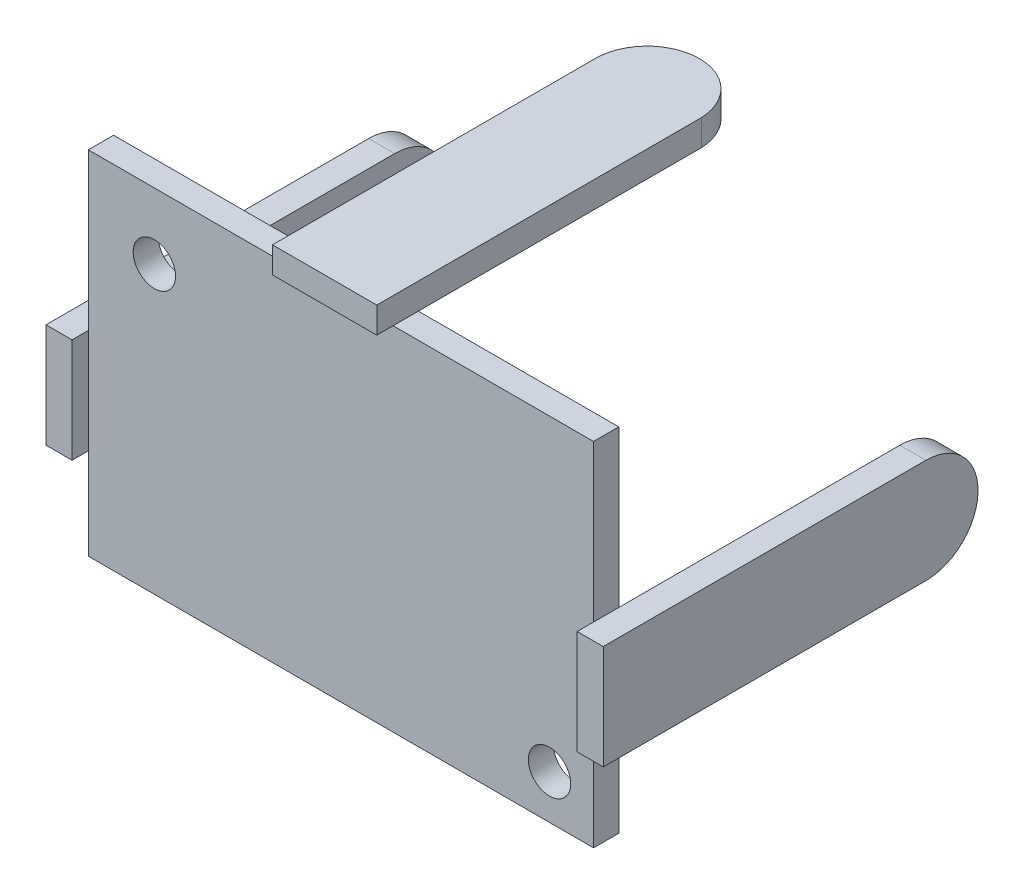
ISO-10303-21;
HEADER;
FILE_DESCRIPTION(('STEP AP214'),'2;1');
FILE_NAME('part.step','',(''),(''),'','','');
FILE_SCHEMA(('AUTOMOTIVE_DESIGN { 1 0 10303 214 1 1 1 1 }'));
ENDSEC;
DATA;
#1=APPLICATION_CONTEXT('core data for automotive mechanical design processes');
#2=APPLICATION_PROTOCOL_DEFINITION('international standard','automotive_design',2000,#1);
#3=PRODUCT_CONTEXT('',#1,'mechanical');
#4=PRODUCT('Part','Part','',(#3));
#5=PRODUCT_RELATED_PRODUCT_CATEGORY('part','',(#4));
#6=PRODUCT_DEFINITION_FORMATION('','',#4);
#7=PRODUCT_DEFINITION_CONTEXT('part definition',#1,'design');
#8=PRODUCT_DEFINITION('design','',#6,#7);
#9=PRODUCT_DEFINITION_SHAPE('','',#8);
#10=(LENGTH_UNIT() NAMED_UNIT(*) SI_UNIT(.MILLI.,.METRE.));
#11=(NAMED_UNIT(*) PLANE_ANGLE_UNIT() SI_UNIT($,.RADIAN.));
#12=(NAMED_UNIT(*) SI_UNIT($,.STERADIAN.) SOLID_ANGLE_UNIT());
#13=UNCERTAINTY_MEASURE_WITH_UNIT(LENGTH_MEASURE(1.E-05),#10,'distance_accuracy_value','');
#14=(GEOMETRIC_REPRESENTATION_CONTEXT(3) GLOBAL_UNCERTAINTY_ASSIGNED_CONTEXT((#13)) GLOBAL_UNIT_ASSIGNED_CONTEXT((#10,
#11,#12)) REPRESENTATION_CONTEXT('',''));
#15=CARTESIAN_POINT('',(0.,0.,0.));
#16=DIRECTION('',(0.,0.,1.));
#17=DIRECTION('',(1.,0.,0.));
#18=AXIS2_PLACEMENT_3D('',#15,#16,#17);
#19=CARTESIAN_POINT('',(17.1,-5.2,1.55));
#20=DIRECTION('',(0.,1.,0.));
#21=DIRECTION('',(0.,0.,1.));
#22=AXIS2_PLACEMENT_3D('',#19,#20,#21);
#23=PLANE('',#22);
#24=DIRECTION('',(0.,0.,-1.));
#25=VECTOR('',#24,1.);
#26=CARTESIAN_POINT('',(15.5,-5.2,1.55));
#27=LINE('',#26,#25);
#28=CARTESIAN_POINT('',(15.5,-5.2,2.55));
#29=VERTEX_POINT('',#28);
#30=CARTESIAN_POINT('',(15.5,-5.2,-17.364147134296));
#31=VERTEX_POINT('',#30);
#32=EDGE_CURVE('E116',#29,#31,#27,.T.);
#33=ORIENTED_EDGE('',*,*,#32,.T.);
#34=DIRECTION('',(-1.,0.,0.));
#35=VECTOR('',#34,1.);
#36=CARTESIAN_POINT('',(17.1,-5.2,-17.364147134296));
#37=LINE('',#36,#35);
#38=CARTESIAN_POINT('',(17.1,-5.2,-17.364147134296));
#39=VERTEX_POINT('',#38);
#40=EDGE_CURVE('E12',#39,#31,#37,.T.);
#41=ORIENTED_EDGE('',*,*,#40,.F.);
#42=DIRECTION('',(0.,0.,-1.));
#43=VECTOR('',#42,1.);
#44=CARTESIAN_POINT('',(17.1,-5.2,1.55));
#45=LINE('',#44,#43);
#46=CARTESIAN_POINT('',(17.1,-5.2,2.55));
#47=VERTEX_POINT('',#46);
#48=EDGE_CURVE('E95',#47,#39,#45,.T.);
#49=ORIENTED_EDGE('',*,*,#48,.F.);
#50=DIRECTION('',(-1.,0.,0.));
#51=VECTOR('',#50,1.);
#52=CARTESIAN_POINT('',(17.1,-5.2,2.55));
#53=LINE('',#52,#51);
#54=EDGE_CURVE('E115',#47,#29,#53,.T.);
#55=ORIENTED_EDGE('',*,*,#54,.T.);
#56=EDGE_LOOP('',(#33,#41,#49,#55));
#57=FACE_BOUND('',#56,.T.);
#58=ADVANCED_FACE('F53',(#57),#23,.F.);
#59=CARTESIAN_POINT('',(17.1,-2.00103650553792,-17.2489634944621));
#60=DIRECTION('',(-1.,0.,0.));
#61=DIRECTION('',(0.,0.,1.));
#62=AXIS2_PLACEMENT_3D('',#59,#60,#61);
#63=CYLINDRICAL_SURFACE('',#62,3.20103650553792);
#64=CARTESIAN_POINT('',(15.5,-2.00103650553792,-17.2489634944621));
#65=DIRECTION('',(-1.,0.,0.));
#66=DIRECTION('',(0.,-1.,0.));
#67=AXIS2_PLACEMENT_3D('',#64,#65,#66);
#68=CIRCLE('',#67,3.20103650553792);
#69=CARTESIAN_POINT('',(15.5,1.2,-17.2489634944621));
#70=VERTEX_POINT('',#69);
#71=EDGE_CURVE('E105',#70,#31,#68,.T.);
#72=ORIENTED_EDGE('',*,*,#71,.F.);
#73=DIRECTION('',(-1.,0.,0.));
#74=VECTOR('',#73,1.);
#75=CARTESIAN_POINT('',(17.1,1.2,-17.2489634944621));
#76=LINE('',#75,#74);
#77=CARTESIAN_POINT('',(17.1,1.2,-17.2489634944621));
#78=VERTEX_POINT('',#77);
#79=EDGE_CURVE('E61',#78,#70,#76,.T.);
#80=ORIENTED_EDGE('',*,*,#79,.F.);
#81=CARTESIAN_POINT('',(17.1,-2.00103650553792,-17.2489634944621));
#82=DIRECTION('',(-1.,0.,0.));
#83=DIRECTION('',(0.,-1.,0.));
#84=AXIS2_PLACEMENT_3D('',#81,#82,#83);
#85=CIRCLE('',#84,3.20103650553792);
#86=EDGE_CURVE('E103',#78,#39,#85,.T.);
#87=ORIENTED_EDGE('',*,*,#86,.T.);
#88=ORIENTED_EDGE('',*,*,#40,.T.);
#89=EDGE_LOOP('',(#72,#80,#87,#88));
#90=FACE_BOUND('',#89,.T.);
#91=ADVANCED_FACE('F102',(#90),#63,.T.);
#92=CARTESIAN_POINT('',(17.1,1.2,1.55));
#93=DIRECTION('',(0.,-1.,0.));
#94=DIRECTION('',(0.,0.,-1.));
#95=AXIS2_PLACEMENT_3D('',#92,#93,#94);
#96=PLANE('',#95);
#97=DIRECTION('',(0.,0.,1.));
#98=VECTOR('',#97,1.);
#99=CARTESIAN_POINT('',(15.5,1.2,1.55));
#100=LINE('',#99,#98);
#101=CARTESIAN_POINT('',(15.5,1.2,2.55));
#102=VERTEX_POINT('',#101);
#103=EDGE_CURVE('E84',#70,#102,#100,.T.);
#104=ORIENTED_EDGE('',*,*,#103,.T.);
#105=DIRECTION('',(-1.,0.,0.));
#106=VECTOR('',#105,1.);
#107=CARTESIAN_POINT('',(17.1,1.2,2.55));
#108=LINE('',#107,#106);
#109=CARTESIAN_POINT('',(17.1,1.2,2.55));
#110=VERTEX_POINT('',#109);
#111=EDGE_CURVE('E106',#110,#102,#108,.T.);
#112=ORIENTED_EDGE('',*,*,#111,.F.);
#113=DIRECTION('',(0.,0.,1.));
#114=VECTOR('',#113,1.);
#115=CARTESIAN_POINT('',(17.1,1.2,1.55));
#116=LINE('',#115,#114);
#117=EDGE_CURVE('E107',#78,#110,#116,.T.);
#118=ORIENTED_EDGE('',*,*,#117,.F.);
#119=ORIENTED_EDGE('',*,*,#79,.T.);
#120=EDGE_LOOP('',(#104,#112,#118,#119));
#121=FACE_BOUND('',#120,.T.);
#122=ADVANCED_FACE('F108',(#121),#96,.F.);
#123=CARTESIAN_POINT('',(17.1,10.8,2.55));
#124=DIRECTION('',(0.,0.,-1.));
#125=DIRECTION('',(0.,1.,0.));
#126=AXIS2_PLACEMENT_3D('',#123,#124,#125);
#127=PLANE('',#126);
#128=DIRECTION('',(0.,-1.,0.));
#129=VECTOR('',#128,1.);
#130=CARTESIAN_POINT('',(15.5,10.8,2.55));
#131=LINE('',#130,#129);
#132=EDGE_CURVE('E90',#102,#29,#131,.T.);
#133=ORIENTED_EDGE('',*,*,#132,.T.);
#134=ORIENTED_EDGE('',*,*,#54,.F.);
#135=DIRECTION('',(0.,-1.,0.));
#136=VECTOR('',#135,1.);
#137=CARTESIAN_POINT('',(17.1,10.8,2.55));
#138=LINE('',#137,#136);
#139=EDGE_CURVE('E69',#110,#47,#138,.T.);
#140=ORIENTED_EDGE('',*,*,#139,.F.);
#141=ORIENTED_EDGE('',*,*,#111,.T.);
#142=EDGE_LOOP('',(#133,#134,#140,#141));
#143=FACE_BOUND('',#142,.T.);
#144=ADVANCED_FACE('F123',(#143),#127,.F.);
#145=CARTESIAN_POINT('',(17.1,-2.00103650553792,-17.2489634944621));
#146=DIRECTION('',(-1.,0.,0.));
#147=DIRECTION('',(0.,-1.,0.));
#148=AXIS2_PLACEMENT_3D('',#145,#146,#147);
#149=PLANE('',#148);
#150=ORIENTED_EDGE('',*,*,#48,.T.);
#151=ORIENTED_EDGE('',*,*,#86,.F.);
#152=ORIENTED_EDGE('',*,*,#117,.T.);
#153=ORIENTED_EDGE('',*,*,#139,.T.);
#154=EDGE_LOOP('',(#150,#151,#152,#153));
#155=FACE_BOUND('',#154,.T.);
#156=ADVANCED_FACE('F110',(#155),#149,.F.);
#157=CARTESIAN_POINT('',(15.5,-2.00103650553792,-17.2489634944621));
#158=DIRECTION('',(-1.,0.,0.));
#159=DIRECTION('',(0.,-1.,0.));
#160=AXIS2_PLACEMENT_3D('',#157,#158,#159);
#161=PLANE('',#160);
#162=ORIENTED_EDGE('',*,*,#32,.F.);
#163=ORIENTED_EDGE('',*,*,#132,.F.);
#164=ORIENTED_EDGE('',*,*,#103,.F.);
#165=ORIENTED_EDGE('',*,*,#71,.T.);
#166=EDGE_LOOP('',(#162,#163,#164,#165));
#167=FACE_BOUND('',#166,.T.);
#168=ADVANCED_FACE('F126',(#167),#161,.T.);
#169=CLOSED_SHELL('',(#58,#91,#122,#144,#156,#168));
#170=MANIFOLD_SOLID_BREP('B2',#169);
#171=CARTESIAN_POINT('',(15.5,10.8,1.55));
#172=DIRECTION('',(0.,-1.,0.));
#173=DIRECTION('',(1.,0.,0.));
#174=AXIS2_PLACEMENT_3D('',#171,#172,#173);
#175=PLANE('',#174);
#176=DIRECTION('',(0.,0.,1.));
#177=VECTOR('',#176,1.);
#178=CARTESIAN_POINT('',(-3.2,10.8,2.55));
#179=LINE('',#178,#177);
#180=CARTESIAN_POINT('',(-3.2,10.8,0.));
#181=VERTEX_POINT('',#180);
#182=CARTESIAN_POINT('',(-3.2,10.8,1.55));
#183=VERTEX_POINT('',#182);
#184=EDGE_CURVE('E51',#181,#183,#179,.T.);
#185=ORIENTED_EDGE('',*,*,#184,.F.);
#186=DIRECTION('',(-1.,0.,0.));
#187=VECTOR('',#186,1.);
#188=CARTESIAN_POINT('',(15.5,10.8,0.));
#189=LINE('',#188,#187);
#190=CARTESIAN_POINT('',(-15.5,10.8,0.));
#191=VERTEX_POINT('',#190);
#192=EDGE_CURVE('E437',#181,#191,#189,.T.);
#193=ORIENTED_EDGE('',*,*,#192,.T.);
#194=DIRECTION('',(0.,0.,-1.));
#195=VECTOR('',#194,1.);
#196=CARTESIAN_POINT('',(-15.5,10.8,1.55));
#197=LINE('',#196,#195);
#198=CARTESIAN_POINT('',(-15.5,10.8,1.55));
#199=VERTEX_POINT('',#198);
#200=EDGE_CURVE('E424',#199,#191,#197,.T.);
#201=ORIENTED_EDGE('',*,*,#200,.F.);
#202=DIRECTION('',(-1.,0.,0.));
#203=VECTOR('',#202,1.);
#204=CARTESIAN_POINT('',(15.5,10.8,1.55));
#205=LINE('',#204,#203);
#206=EDGE_CURVE('E209',#183,#199,#205,.T.);
#207=ORIENTED_EDGE('',*,*,#206,.F.);
#208=EDGE_LOOP('',(#185,#193,#201,#207));
#209=FACE_BOUND('',#208,.T.);
#210=ADVANCED_FACE('F189',(#209),#175,.F.);
#211=DIRECTION('',(0.,0.,-1.));
#212=VECTOR('',#211,1.);
#213=CARTESIAN_POINT('',(3.2,10.8,2.55));
#214=LINE('',#213,#212);
#215=CARTESIAN_POINT('',(3.2,10.8,1.55));
#216=VERTEX_POINT('',#215);
#217=CARTESIAN_POINT('',(3.2,10.8,0.));
#218=VERTEX_POINT('',#217);
#219=EDGE_CURVE('E199',#216,#218,#214,.T.);
#220=ORIENTED_EDGE('',*,*,#219,.F.);
#221=CARTESIAN_POINT('',(15.5,10.8,1.55));
#222=VERTEX_POINT('',#221);
#223=EDGE_CURVE('E421',#222,#216,#205,.T.);
#224=ORIENTED_EDGE('',*,*,#223,.F.);
#225=DIRECTION('',(0.,0.,-1.));
#226=VECTOR('',#225,1.);
#227=CARTESIAN_POINT('',(15.5,10.8,1.55));
#228=LINE('',#227,#226);
#229=CARTESIAN_POINT('',(15.5,10.8,0.));
#230=VERTEX_POINT('',#229);
#231=EDGE_CURVE('E445',#222,#230,#228,.T.);
#232=ORIENTED_EDGE('',*,*,#231,.T.);
#233=EDGE_CURVE('E438',#230,#218,#189,.T.);
#234=ORIENTED_EDGE('',*,*,#233,.T.);
#235=EDGE_LOOP('',(#220,#224,#232,#234));
#236=FACE_BOUND('',#235,.T.);
#237=ADVANCED_FACE('F550',(#236),#175,.F.);
#238=CARTESIAN_POINT('',(-15.5,10.8,1.55));
#239=DIRECTION('',(1.,0.,0.));
#240=DIRECTION('',(0.,1.,0.));
#241=AXIS2_PLACEMENT_3D('',#238,#239,#240);
#242=PLANE('',#241);
#243=DIRECTION('',(0.,-1.,0.));
#244=VECTOR('',#243,1.);
#245=CARTESIAN_POINT('',(-15.5,10.8,1.55));
#246=LINE('',#245,#244);
#247=CARTESIAN_POINT('',(-15.5,-5.2,1.55));
#248=VERTEX_POINT('',#247);
#249=CARTESIAN_POINT('',(-15.5,-10.8,1.55));
#250=VERTEX_POINT('',#249);
#251=EDGE_CURVE('E415',#248,#250,#246,.T.);
#252=ORIENTED_EDGE('',*,*,#251,.F.);
#253=DIRECTION('',(0.,0.,-1.));
#254=VECTOR('',#253,1.);
#255=CARTESIAN_POINT('',(-15.5,-5.2,1.55));
#256=LINE('',#255,#254);
#257=CARTESIAN_POINT('',(-15.5,-5.2,0.));
#258=VERTEX_POINT('',#257);
#259=EDGE_CURVE('E341',#248,#258,#256,.T.);
#260=ORIENTED_EDGE('',*,*,#259,.T.);
#261=DIRECTION('',(0.,-1.,0.));
#262=VECTOR('',#261,1.);
#263=CARTESIAN_POINT('',(-15.5,10.8,0.));
#264=LINE('',#263,#262);
#265=CARTESIAN_POINT('',(-15.5,-10.8,0.));
#266=VERTEX_POINT('',#265);
#267=EDGE_CURVE('E405',#258,#266,#264,.T.);
#268=ORIENTED_EDGE('',*,*,#267,.T.);
#269=DIRECTION('',(0.,0.,-1.));
#270=VECTOR('',#269,1.);
#271=CARTESIAN_POINT('',(-15.5,-10.8,1.55));
#272=LINE('',#271,#270);
#273=EDGE_CURVE('E193',#250,#266,#272,.T.);
#274=ORIENTED_EDGE('',*,*,#273,.F.);
#275=EDGE_LOOP('',(#252,#260,#268,#274));
#276=FACE_BOUND('',#275,.T.);
#277=ADVANCED_FACE('F486',(#276),#242,.F.);
#278=CARTESIAN_POINT('',(0.,0.,1.55));
#279=DIRECTION('',(0.,0.,-1.));
#280=DIRECTION('',(-1.,0.,0.));
#281=AXIS2_PLACEMENT_3D('',#278,#279,#280);
#282=PLANE('',#281);
#283=CARTESIAN_POINT('',(-15.5,1.2,1.55));
#284=VERTEX_POINT('',#283);
#285=EDGE_CURVE('E409',#199,#284,#246,.T.);
#286=ORIENTED_EDGE('',*,*,#285,.T.);
#287=EDGE_CURVE('E414',#284,#248,#246,.T.);
#288=ORIENTED_EDGE('',*,*,#287,.T.);
#289=ORIENTED_EDGE('',*,*,#251,.T.);
#290=DIRECTION('',(1.,0.,0.));
#291=VECTOR('',#290,1.);
#292=CARTESIAN_POINT('',(15.5,-10.8,1.55));
#293=LINE('',#292,#291);
#294=CARTESIAN_POINT('',(15.5,-10.8,1.55));
#295=VERTEX_POINT('',#294);
#296=EDGE_CURVE('E413',#250,#295,#293,.T.);
#297=ORIENTED_EDGE('',*,*,#296,.T.);
#298=DIRECTION('',(0.,1.,0.));
#299=VECTOR('',#298,1.);
#300=CARTESIAN_POINT('',(15.5,10.8,1.55));
#301=LINE('',#300,#299);
#302=EDGE_CURVE('E418',#295,#222,#301,.T.);
#303=ORIENTED_EDGE('',*,*,#302,.T.);
#304=ORIENTED_EDGE('',*,*,#223,.T.);
#305=EDGE_CURVE('E425',#216,#183,#205,.T.);
#306=ORIENTED_EDGE('',*,*,#305,.T.);
#307=ORIENTED_EDGE('',*,*,#206,.T.);
#308=EDGE_LOOP('',(#286,#288,#289,#297,#303,#304,#306,#307));
#309=FACE_BOUND('',#308,.T.);
#310=CARTESIAN_POINT('',(12.8,-8.1,1.55));
#311=DIRECTION('',(0.,0.,1.));
#312=DIRECTION('',(1.,0.,0.));
#313=AXIS2_PLACEMENT_3D('',#310,#311,#312);
#314=CIRCLE('',#313,1.3);
#315=CARTESIAN_POINT('',(11.5,-8.1,1.55));
#316=VERTEX_POINT('',#315);
#317=EDGE_CURVE('E401',#316,#316,#314,.T.);
#318=ORIENTED_EDGE('',*,*,#317,.F.);
#319=EDGE_LOOP('',(#318));
#320=FACE_BOUND('',#319,.T.);
#321=CARTESIAN_POINT('',(-11.45,6.75,1.55));
#322=DIRECTION('',(0.,0.,1.));
#323=DIRECTION('',(1.,0.,0.));
#324=AXIS2_PLACEMENT_3D('',#321,#322,#323);
#325=CIRCLE('',#324,1.3);
#326=CARTESIAN_POINT('',(-12.75,6.75,1.55));
#327=VERTEX_POINT('',#326);
#328=EDGE_CURVE('E393',#327,#327,#325,.T.);
#329=ORIENTED_EDGE('',*,*,#328,.F.);
#330=EDGE_LOOP('',(#329));
#331=FACE_BOUND('',#330,.T.);
#332=ADVANCED_FACE('F490',(#309,#320,#331),#282,.F.);
#333=CARTESIAN_POINT('',(0.,0.,0.));
#334=DIRECTION('',(0.,0.,-1.));
#335=DIRECTION('',(-1.,0.,0.));
#336=AXIS2_PLACEMENT_3D('',#333,#334,#335);
#337=PLANE('',#336);
#338=CARTESIAN_POINT('',(12.8,-8.1,0.));
#339=DIRECTION('',(0.,0.,1.));
#340=DIRECTION('',(1.,0.,0.));
#341=AXIS2_PLACEMENT_3D('',#338,#339,#340);
#342=CIRCLE('',#341,1.3);
#343=CARTESIAN_POINT('',(11.5,-8.1,0.));
#344=VERTEX_POINT('',#343);
#345=EDGE_CURVE('E397',#344,#344,#342,.T.);
#346=ORIENTED_EDGE('',*,*,#345,.T.);
#347=EDGE_LOOP('',(#346));
#348=FACE_BOUND('',#347,.T.);
#349=CARTESIAN_POINT('',(-15.5,1.2,0.));
#350=VERTEX_POINT('',#349);
#351=EDGE_CURVE('E426',#191,#350,#264,.T.);
#352=ORIENTED_EDGE('',*,*,#351,.F.);
#353=ORIENTED_EDGE('',*,*,#192,.F.);
#354=EDGE_CURVE('E441',#218,#181,#189,.T.);
#355=ORIENTED_EDGE('',*,*,#354,.F.);
#356=ORIENTED_EDGE('',*,*,#233,.F.);
#357=DIRECTION('',(0.,1.,0.));
#358=VECTOR('',#357,1.);
#359=CARTESIAN_POINT('',(15.5,10.8,0.));
#360=LINE('',#359,#358);
#361=CARTESIAN_POINT('',(15.5,-10.8,0.));
#362=VERTEX_POINT('',#361);
#363=EDGE_CURVE('E434',#362,#230,#360,.T.);
#364=ORIENTED_EDGE('',*,*,#363,.F.);
#365=DIRECTION('',(1.,0.,0.));
#366=VECTOR('',#365,1.);
#367=CARTESIAN_POINT('',(15.5,-10.8,0.));
#368=LINE('',#367,#366);
#369=EDGE_CURVE('E430',#266,#362,#368,.T.);
#370=ORIENTED_EDGE('',*,*,#369,.F.);
#371=ORIENTED_EDGE('',*,*,#267,.F.);
#372=EDGE_CURVE('E431',#350,#258,#264,.T.);
#373=ORIENTED_EDGE('',*,*,#372,.F.);
#374=EDGE_LOOP('',(#352,#353,#355,#356,#364,#370,#371,#373));
#375=FACE_BOUND('',#374,.T.);
#376=CARTESIAN_POINT('',(-11.45,6.75,0.));
#377=DIRECTION('',(0.,0.,1.));
#378=DIRECTION('',(1.,0.,0.));
#379=AXIS2_PLACEMENT_3D('',#376,#377,#378);
#380=CIRCLE('',#379,1.3);
#381=CARTESIAN_POINT('',(-12.75,6.75,0.));
#382=VERTEX_POINT('',#381);
#383=EDGE_CURVE('E382',#382,#382,#380,.T.);
#384=ORIENTED_EDGE('',*,*,#383,.T.);
#385=EDGE_LOOP('',(#384));
#386=FACE_BOUND('',#385,.T.);
#387=ADVANCED_FACE('F502',(#348,#375,#386),#337,.T.);
#388=ORIENTED_EDGE('',*,*,#351,.T.);
#389=DIRECTION('',(0.,0.,1.));
#390=VECTOR('',#389,1.);
#391=CARTESIAN_POINT('',(-15.5,1.2,1.55));
#392=LINE('',#391,#390);
#393=EDGE_CURVE('E375',#350,#284,#392,.T.);
#394=ORIENTED_EDGE('',*,*,#393,.T.);
#395=ORIENTED_EDGE('',*,*,#285,.F.);
#396=ORIENTED_EDGE('',*,*,#200,.T.);
#397=EDGE_LOOP('',(#388,#394,#395,#396));
#398=FACE_BOUND('',#397,.T.);
#399=ADVANCED_FACE('F191',(#398),#242,.F.);
#400=CARTESIAN_POINT('',(15.5,-10.8,1.55));
#401=DIRECTION('',(0.,1.,0.));
#402=DIRECTION('',(-1.,0.,0.));
#403=AXIS2_PLACEMENT_3D('',#400,#401,#402);
#404=PLANE('',#403);
#405=ORIENTED_EDGE('',*,*,#369,.T.);
#406=DIRECTION('',(0.,0.,-1.));
#407=VECTOR('',#406,1.);
#408=CARTESIAN_POINT('',(15.5,-10.8,1.55));
#409=LINE('',#408,#407);
#410=EDGE_CURVE('E448',#295,#362,#409,.T.);
#411=ORIENTED_EDGE('',*,*,#410,.F.);
#412=ORIENTED_EDGE('',*,*,#296,.F.);
#413=ORIENTED_EDGE('',*,*,#273,.T.);
#414=EDGE_LOOP('',(#405,#411,#412,#413));
#415=FACE_BOUND('',#414,.T.);
#416=ADVANCED_FACE('F505',(#415),#404,.F.);
#417=CARTESIAN_POINT('',(15.5,10.8,1.55));
#418=DIRECTION('',(-1.,0.,0.));
#419=DIRECTION('',(0.,-1.,0.));
#420=AXIS2_PLACEMENT_3D('',#417,#418,#419);
#421=PLANE('',#420);
#422=ORIENTED_EDGE('',*,*,#363,.T.);
#423=ORIENTED_EDGE('',*,*,#231,.F.);
#424=ORIENTED_EDGE('',*,*,#302,.F.);
#425=ORIENTED_EDGE('',*,*,#410,.T.);
#426=EDGE_LOOP('',(#422,#423,#424,#425));
#427=FACE_BOUND('',#426,.T.);
#428=ADVANCED_FACE('F507',(#427),#421,.F.);
#429=CARTESIAN_POINT('',(12.8,-8.1,1.55));
#430=DIRECTION('',(0.,0.,-1.));
#431=DIRECTION('',(-1.,0.,0.));
#432=AXIS2_PLACEMENT_3D('',#429,#430,#431);
#433=CYLINDRICAL_SURFACE('',#432,1.3);
#434=CARTESIAN_POINT('',(11.5,-8.1,1.55));
#435=CARTESIAN_POINT('',(11.5,-8.1,1.53385416666667));
#436=CARTESIAN_POINT('',(11.5,-8.1,1.51770833333333));
#437=CARTESIAN_POINT('',(11.5,-8.1,1.48541666666667));
#438=CARTESIAN_POINT('',(11.5,-8.1,1.46927083333333));
#439=CARTESIAN_POINT('',(11.5,-8.1,1.43697916666667));
#440=CARTESIAN_POINT('',(11.5,-8.1,1.42083333333333));
#441=CARTESIAN_POINT('',(11.5,-8.1,1.38854166666667));
#442=CARTESIAN_POINT('',(11.5,-8.1,1.37239583333333));
#443=CARTESIAN_POINT('',(11.5,-8.1,1.34010416666667));
#444=CARTESIAN_POINT('',(11.5,-8.1,1.32395833333333));
#445=CARTESIAN_POINT('',(11.5,-8.1,1.29166666666667));
#446=CARTESIAN_POINT('',(11.5,-8.1,1.27552083333333));
#447=CARTESIAN_POINT('',(11.5,-8.1,1.24322916666667));
#448=CARTESIAN_POINT('',(11.5,-8.1,1.22708333333333));
#449=CARTESIAN_POINT('',(11.5,-8.1,1.19479166666667));
#450=CARTESIAN_POINT('',(11.5,-8.1,1.17864583333333));
#451=CARTESIAN_POINT('',(11.5,-8.1,1.14635416666667));
#452=CARTESIAN_POINT('',(11.5,-8.1,1.13020833333333));
#453=CARTESIAN_POINT('',(11.5,-8.1,1.09791666666667));
#454=CARTESIAN_POINT('',(11.5,-8.1,1.08177083333333));
#455=CARTESIAN_POINT('',(11.5,-8.1,1.04947916666667));
#456=CARTESIAN_POINT('',(11.5,-8.1,1.03333333333333));
#457=CARTESIAN_POINT('',(11.5,-8.1,1.00104166666667));
#458=CARTESIAN_POINT('',(11.5,-8.1,0.984895833333333));
#459=CARTESIAN_POINT('',(11.5,-8.1,0.952604166666667));
#460=CARTESIAN_POINT('',(11.5,-8.1,0.936458333333333));
#461=CARTESIAN_POINT('',(11.5,-8.1,0.904166666666667));
#462=CARTESIAN_POINT('',(11.5,-8.1,0.888020833333333));
#463=CARTESIAN_POINT('',(11.5,-8.1,0.855729166666667));
#464=CARTESIAN_POINT('',(11.5,-8.1,0.839583333333333));
#465=CARTESIAN_POINT('',(11.5,-8.1,0.807291666666667));
#466=CARTESIAN_POINT('',(11.5,-8.1,0.791145833333333));
#467=CARTESIAN_POINT('',(11.5,-8.1,0.758854166666667));
#468=CARTESIAN_POINT('',(11.5,-8.1,0.742708333333333));
#469=CARTESIAN_POINT('',(11.5,-8.1,0.710416666666667));
#470=CARTESIAN_POINT('',(11.5,-8.1,0.694270833333333));
#471=CARTESIAN_POINT('',(11.5,-8.1,0.661979166666667));
#472=CARTESIAN_POINT('',(11.5,-8.1,0.645833333333333));
#473=CARTESIAN_POINT('',(11.5,-8.1,0.613541666666667));
#474=CARTESIAN_POINT('',(11.5,-8.1,0.597395833333333));
#475=CARTESIAN_POINT('',(11.5,-8.1,0.565104166666667));
#476=CARTESIAN_POINT('',(11.5,-8.1,0.548958333333333));
#477=CARTESIAN_POINT('',(11.5,-8.1,0.516666666666667));
#478=CARTESIAN_POINT('',(11.5,-8.1,0.500520833333333));
#479=CARTESIAN_POINT('',(11.5,-8.1,0.468229166666667));
#480=CARTESIAN_POINT('',(11.5,-8.1,0.452083333333333));
#481=CARTESIAN_POINT('',(11.5,-8.1,0.419791666666667));
#482=CARTESIAN_POINT('',(11.5,-8.1,0.403645833333333));
#483=CARTESIAN_POINT('',(11.5,-8.1,0.371354166666667));
#484=CARTESIAN_POINT('',(11.5,-8.1,0.355208333333333));
#485=CARTESIAN_POINT('',(11.5,-8.1,0.322916666666667));
#486=CARTESIAN_POINT('',(11.5,-8.1,0.306770833333333));
#487=CARTESIAN_POINT('',(11.5,-8.1,0.274479166666667));
#488=CARTESIAN_POINT('',(11.5,-8.1,0.258333333333333));
#489=CARTESIAN_POINT('',(11.5,-8.1,0.226041666666667));
#490=CARTESIAN_POINT('',(11.5,-8.1,0.209895833333333));
#491=CARTESIAN_POINT('',(11.5,-8.1,0.177604166666667));
#492=CARTESIAN_POINT('',(11.5,-8.1,0.161458333333333));
#493=CARTESIAN_POINT('',(11.5,-8.1,0.129166666666667));
#494=CARTESIAN_POINT('',(11.5,-8.1,0.113020833333333));
#495=CARTESIAN_POINT('',(11.5,-8.1,0.0807291666666667));
#496=CARTESIAN_POINT('',(11.5,-8.1,0.0645833333333334));
#497=CARTESIAN_POINT('',(11.5,-8.1,0.0322916666666667));
#498=CARTESIAN_POINT('',(11.5,-8.1,0.0161458333333334));
#499=CARTESIAN_POINT('',(11.5,-8.1,0.));
#500=B_SPLINE_CURVE_WITH_KNOTS('',3,(#434,#435,#436,#437,#438,#439,#440,#441,#442,#443,#444,
#445,#446,#447,#448,#449,#450,#451,#452,#453,#454,#455,#456,#457,#458,#459,#460,#461,#462,#463,
#464,#465,#466,#467,#468,#469,#470,#471,#472,#473,#474,#475,#476,#477,#478,#479,#480,#481,#482,
#483,#484,#485,#486,#487,#488,#489,#490,#491,#492,#493,#494,#495,#496,#497,#498,#499),
.UNSPECIFIED.,.F.,.F.,(4,2,2,2,2,2,2,2,2,2,2,2,2,2,2,2,2,2,2,2,2,2,2,2,2,2,2,2,2,2,2,2,4),(0.,
0.0484374999999999,0.096875,0.1453125,0.19375,0.2421875,0.290625,0.3390625,0.3875,0.4359375,
0.484375,0.5328125,0.58125,0.6296875,0.678125,0.7265625,0.775,0.8234375,0.871875,0.9203125,
0.96875,1.0171875,1.065625,1.1140625,1.1625,1.2109375,1.259375,1.3078125,1.35625,1.4046875,
1.453125,1.5015625,1.55),.UNSPECIFIED.);
#501=EDGE_CURVE('BSEAM559',#316,#344,#500,.T.);
#502=ORIENTED_EDGE('',*,*,#317,.T.);
#503=ORIENTED_EDGE('',*,*,#345,.F.);
#504=ORIENTED_EDGE('',*,*,#501,.T.);
#505=ORIENTED_EDGE('',*,*,#501,.F.);
#506=EDGE_LOOP('',(#502,#504,#503,#505));
#507=FACE_BOUND('',#506,.T.);
#508=ADVANCED_FACE('F559',(#507),#433,.F.);
#509=CARTESIAN_POINT('',(-11.45,6.75,1.55));
#510=DIRECTION('',(0.,0.,-1.));
#511=DIRECTION('',(-1.,0.,0.));
#512=AXIS2_PLACEMENT_3D('',#509,#510,#511);
#513=CYLINDRICAL_SURFACE('',#512,1.3);
#514=CARTESIAN_POINT('',(-12.75,6.75,1.55));
#515=CARTESIAN_POINT('',(-12.75,6.75,1.53385416666667));
#516=CARTESIAN_POINT('',(-12.75,6.75,1.51770833333333));
#517=CARTESIAN_POINT('',(-12.75,6.75,1.48541666666667));
#518=CARTESIAN_POINT('',(-12.75,6.75,1.46927083333333));
#519=CARTESIAN_POINT('',(-12.75,6.75,1.43697916666667));
#520=CARTESIAN_POINT('',(-12.75,6.75,1.42083333333333));
#521=CARTESIAN_POINT('',(-12.75,6.75,1.38854166666667));
#522=CARTESIAN_POINT('',(-12.75,6.75,1.37239583333333));
#523=CARTESIAN_POINT('',(-12.75,6.75,1.34010416666667));
#524=CARTESIAN_POINT('',(-12.75,6.75,1.32395833333333));
#525=CARTESIAN_POINT('',(-12.75,6.75,1.29166666666667));
#526=CARTESIAN_POINT('',(-12.75,6.75,1.27552083333333));
#527=CARTESIAN_POINT('',(-12.75,6.75,1.24322916666667));
#528=CARTESIAN_POINT('',(-12.75,6.75,1.22708333333333));
#529=CARTESIAN_POINT('',(-12.75,6.75,1.19479166666667));
#530=CARTESIAN_POINT('',(-12.75,6.75,1.17864583333333));
#531=CARTESIAN_POINT('',(-12.75,6.75,1.14635416666667));
#532=CARTESIAN_POINT('',(-12.75,6.75,1.13020833333333));
#533=CARTESIAN_POINT('',(-12.75,6.75,1.09791666666667));
#534=CARTESIAN_POINT('',(-12.75,6.75,1.08177083333333));
#535=CARTESIAN_POINT('',(-12.75,6.75,1.04947916666667));
#536=CARTESIAN_POINT('',(-12.75,6.75,1.03333333333333));
#537=CARTESIAN_POINT('',(-12.75,6.75,1.00104166666667));
#538=CARTESIAN_POINT('',(-12.75,6.75,0.984895833333333));
#539=CARTESIAN_POINT('',(-12.75,6.75,0.952604166666667));
#540=CARTESIAN_POINT('',(-12.75,6.75,0.936458333333333));
#541=CARTESIAN_POINT('',(-12.75,6.75,0.904166666666667));
#542=CARTESIAN_POINT('',(-12.75,6.75,0.888020833333333));
#543=CARTESIAN_POINT('',(-12.75,6.75,0.855729166666667));
#544=CARTESIAN_POINT('',(-12.75,6.75,0.839583333333333));
#545=CARTESIAN_POINT('',(-12.75,6.75,0.807291666666667));
#546=CARTESIAN_POINT('',(-12.75,6.75,0.791145833333333));
#547=CARTESIAN_POINT('',(-12.75,6.75,0.758854166666667));
#548=CARTESIAN_POINT('',(-12.75,6.75,0.742708333333333));
#549=CARTESIAN_POINT('',(-12.75,6.75,0.710416666666667));
#550=CARTESIAN_POINT('',(-12.75,6.75,0.694270833333333));
#551=CARTESIAN_POINT('',(-12.75,6.75,0.661979166666667));
#552=CARTESIAN_POINT('',(-12.75,6.75,0.645833333333333));
#553=CARTESIAN_POINT('',(-12.75,6.75,0.613541666666667));
#554=CARTESIAN_POINT('',(-12.75,6.75,0.597395833333333));
#555=CARTESIAN_POINT('',(-12.75,6.75,0.565104166666667));
#556=CARTESIAN_POINT('',(-12.75,6.75,0.548958333333333));
#557=CARTESIAN_POINT('',(-12.75,6.75,0.516666666666667));
#558=CARTESIAN_POINT('',(-12.75,6.75,0.500520833333333));
#559=CARTESIAN_POINT('',(-12.75,6.75,0.468229166666667));
#560=CARTESIAN_POINT('',(-12.75,6.75,0.452083333333333));
#561=CARTESIAN_POINT('',(-12.75,6.75,0.419791666666667));
#562=CARTESIAN_POINT('',(-12.75,6.75,0.403645833333333));
#563=CARTESIAN_POINT('',(-12.75,6.75,0.371354166666667));
#564=CARTESIAN_POINT('',(-12.75,6.75,0.355208333333333));
#565=CARTESIAN_POINT('',(-12.75,6.75,0.322916666666667));
#566=CARTESIAN_POINT('',(-12.75,6.75,0.306770833333333));
#567=CARTESIAN_POINT('',(-12.75,6.75,0.274479166666667));
#568=CARTESIAN_POINT('',(-12.75,6.75,0.258333333333333));
#569=CARTESIAN_POINT('',(-12.75,6.75,0.226041666666667));
#570=CARTESIAN_POINT('',(-12.75,6.75,0.209895833333333));
#571=CARTESIAN_POINT('',(-12.75,6.75,0.177604166666667));
#572=CARTESIAN_POINT('',(-12.75,6.75,0.161458333333333));
#573=CARTESIAN_POINT('',(-12.75,6.75,0.129166666666667));
#574=CARTESIAN_POINT('',(-12.75,6.75,0.113020833333333));
#575=CARTESIAN_POINT('',(-12.75,6.75,0.0807291666666667));
#576=CARTESIAN_POINT('',(-12.75,6.75,0.0645833333333334));
#577=CARTESIAN_POINT('',(-12.75,6.75,0.0322916666666667));
#578=CARTESIAN_POINT('',(-12.75,6.75,0.0161458333333334));
#579=CARTESIAN_POINT('',(-12.75,6.75,0.));
#580=B_SPLINE_CURVE_WITH_KNOTS('',3,(#514,#515,#516,#517,#518,#519,#520,#521,#522,#523,#524,
#525,#526,#527,#528,#529,#530,#531,#532,#533,#534,#535,#536,#537,#538,#539,#540,#541,#542,#543,
#544,#545,#546,#547,#548,#549,#550,#551,#552,#553,#554,#555,#556,#557,#558,#559,#560,#561,#562,
#563,#564,#565,#566,#567,#568,#569,#570,#571,#572,#573,#574,#575,#576,#577,#578,#579),
.UNSPECIFIED.,.F.,.F.,(4,2,2,2,2,2,2,2,2,2,2,2,2,2,2,2,2,2,2,2,2,2,2,2,2,2,2,2,2,2,2,2,4),(0.,
0.0484374999999999,0.096875,0.1453125,0.19375,0.2421875,0.290625,0.3390625,0.3875,0.4359375,
0.484375,0.5328125,0.58125,0.6296875,0.678125,0.7265625,0.775,0.8234375,0.871875,0.9203125,
0.96875,1.0171875,1.065625,1.1140625,1.1625,1.2109375,1.259375,1.3078125,1.35625,1.4046875,
1.453125,1.5015625,1.55),.UNSPECIFIED.);
#581=EDGE_CURVE('BSEAM563',#327,#382,#580,.T.);
#582=ORIENTED_EDGE('',*,*,#328,.T.);
#583=ORIENTED_EDGE('',*,*,#383,.F.);
#584=ORIENTED_EDGE('',*,*,#581,.T.);
#585=ORIENTED_EDGE('',*,*,#581,.F.);
#586=EDGE_LOOP('',(#582,#584,#583,#585));
#587=FACE_BOUND('',#586,.T.);
#588=ADVANCED_FACE('F563',(#587),#513,.F.);
#589=CARTESIAN_POINT('',(-15.5,-2.00103650553792,-17.2489634944621));
#590=DIRECTION('',(1.,0.,0.));
#591=DIRECTION('',(0.,1.,0.));
#592=AXIS2_PLACEMENT_3D('',#589,#590,#591);
#593=PLANE('',#592);
#594=ORIENTED_EDGE('',*,*,#287,.F.);
#595=CARTESIAN_POINT('',(-15.5,1.2,2.55));
#596=VERTEX_POINT('',#595);
#597=EDGE_CURVE('E370',#284,#596,#392,.T.);
#598=ORIENTED_EDGE('',*,*,#597,.T.);
#599=DIRECTION('',(0.,-1.,0.));
#600=VECTOR('',#599,1.);
#601=CARTESIAN_POINT('',(-15.5,10.8,2.55));
#602=LINE('',#601,#600);
#603=CARTESIAN_POINT('',(-15.5,-5.2,2.55));
#604=VERTEX_POINT('',#603);
#605=EDGE_CURVE('E351',#596,#604,#602,.T.);
#606=ORIENTED_EDGE('',*,*,#605,.T.);
#607=EDGE_CURVE('E339',#604,#248,#256,.T.);
#608=ORIENTED_EDGE('',*,*,#607,.T.);
#609=EDGE_LOOP('',(#594,#598,#606,#608));
#610=FACE_BOUND('',#609,.T.);
#611=ADVANCED_FACE('F469',(#610),#593,.T.);
#612=CARTESIAN_POINT('',(-17.1,-5.2,1.55));
#613=DIRECTION('',(0.,-1.,0.));
#614=DIRECTION('',(0.,0.,-1.));
#615=AXIS2_PLACEMENT_3D('',#612,#613,#614);
#616=PLANE('',#615);
#617=ORIENTED_EDGE('',*,*,#607,.F.);
#618=DIRECTION('',(1.,0.,0.));
#619=VECTOR('',#618,1.);
#620=CARTESIAN_POINT('',(-17.1,-5.2,2.55));
#621=LINE('',#620,#619);
#622=CARTESIAN_POINT('',(-17.1,-5.2,2.55));
#623=VERTEX_POINT('',#622);
#624=EDGE_CURVE('E379',#623,#604,#621,.T.);
#625=ORIENTED_EDGE('',*,*,#624,.F.);
#626=DIRECTION('',(0.,0.,-1.));
#627=VECTOR('',#626,1.);
#628=CARTESIAN_POINT('',(-17.1,-5.2,1.55));
#629=LINE('',#628,#627);
#630=CARTESIAN_POINT('',(-17.1,-5.2,-17.364147134296));
#631=VERTEX_POINT('',#630);
#632=EDGE_CURVE('E346',#623,#631,#629,.T.);
#633=ORIENTED_EDGE('',*,*,#632,.T.);
#634=DIRECTION('',(1.,0.,0.));
#635=VECTOR('',#634,1.);
#636=CARTESIAN_POINT('',(-17.1,-5.2,-17.364147134296));
#637=LINE('',#636,#635);
#638=CARTESIAN_POINT('',(-15.5,-5.2,-17.364147134296));
#639=VERTEX_POINT('',#638);
#640=EDGE_CURVE('E362',#631,#639,#637,.T.);
#641=ORIENTED_EDGE('',*,*,#640,.T.);
#642=EDGE_CURVE('E335',#258,#639,#256,.T.);
#643=ORIENTED_EDGE('',*,*,#642,.F.);
#644=ORIENTED_EDGE('',*,*,#259,.F.);
#645=EDGE_LOOP('',(#617,#625,#633,#641,#643,#644));
#646=FACE_BOUND('',#645,.T.);
#647=ADVANCED_FACE('F482',(#646),#616,.T.);
#648=CARTESIAN_POINT('',(-17.1,10.8,2.55));
#649=DIRECTION('',(0.,0.,1.));
#650=DIRECTION('',(0.,-1.,0.));
#651=AXIS2_PLACEMENT_3D('',#648,#649,#650);
#652=PLANE('',#651);
#653=ORIENTED_EDGE('',*,*,#605,.F.);
#654=DIRECTION('',(1.,0.,0.));
#655=VECTOR('',#654,1.);
#656=CARTESIAN_POINT('',(-17.1,1.2,2.55));
#657=LINE('',#656,#655);
#658=CARTESIAN_POINT('',(-17.1,1.2,2.55));
#659=VERTEX_POINT('',#658);
#660=EDGE_CURVE('E383',#659,#596,#657,.T.);
#661=ORIENTED_EDGE('',*,*,#660,.F.);
#662=DIRECTION('',(0.,-1.,0.));
#663=VECTOR('',#662,1.);
#664=CARTESIAN_POINT('',(-17.1,10.8,2.55));
#665=LINE('',#664,#663);
#666=EDGE_CURVE('E359',#659,#623,#665,.T.);
#667=ORIENTED_EDGE('',*,*,#666,.T.);
#668=ORIENTED_EDGE('',*,*,#624,.T.);
#669=EDGE_LOOP('',(#653,#661,#667,#668));
#670=FACE_BOUND('',#669,.T.);
#671=ADVANCED_FACE('F478',(#670),#652,.T.);
#672=CARTESIAN_POINT('',(-17.1,1.2,1.55));
#673=DIRECTION('',(0.,1.,0.));
#674=DIRECTION('',(0.,0.,1.));
#675=AXIS2_PLACEMENT_3D('',#672,#673,#674);
#676=PLANE('',#675);
#677=CARTESIAN_POINT('',(-15.5,1.2,-17.2489634944621));
#678=VERTEX_POINT('',#677);
#679=EDGE_CURVE('E371',#678,#350,#392,.T.);
#680=ORIENTED_EDGE('',*,*,#679,.F.);
#681=DIRECTION('',(1.,0.,0.));
#682=VECTOR('',#681,1.);
#683=CARTESIAN_POINT('',(-17.1,1.2,-17.2489634944621));
#684=LINE('',#683,#682);
#685=CARTESIAN_POINT('',(-17.1,1.2,-17.2489634944621));
#686=VERTEX_POINT('',#685);
#687=EDGE_CURVE('E387',#686,#678,#684,.T.);
#688=ORIENTED_EDGE('',*,*,#687,.F.);
#689=DIRECTION('',(0.,0.,1.));
#690=VECTOR('',#689,1.);
#691=CARTESIAN_POINT('',(-17.1,1.2,1.55));
#692=LINE('',#691,#690);
#693=EDGE_CURVE('E355',#686,#659,#692,.T.);
#694=ORIENTED_EDGE('',*,*,#693,.T.);
#695=ORIENTED_EDGE('',*,*,#660,.T.);
#696=ORIENTED_EDGE('',*,*,#597,.F.);
#697=ORIENTED_EDGE('',*,*,#393,.F.);
#698=EDGE_LOOP('',(#680,#688,#694,#695,#696,#697));
#699=FACE_BOUND('',#698,.T.);
#700=ADVANCED_FACE('F474',(#699),#676,.T.);
#701=CARTESIAN_POINT('',(-17.1,-2.00103650553792,-17.2489634944621));
#702=DIRECTION('',(1.,0.,0.));
#703=DIRECTION('',(0.,0.,-1.));
#704=AXIS2_PLACEMENT_3D('',#701,#702,#703);
#705=CYLINDRICAL_SURFACE('',#704,3.20103650553792);
#706=CARTESIAN_POINT('',(-15.5,-2.00103650553792,-17.2489634944621));
#707=DIRECTION('',(1.,0.,0.));
#708=DIRECTION('',(0.,1.,0.));
#709=AXIS2_PLACEMENT_3D('',#706,#707,#708);
#710=CIRCLE('',#709,3.20103650553792);
#711=EDGE_CURVE('E366',#639,#678,#710,.T.);
#712=ORIENTED_EDGE('',*,*,#711,.F.);
#713=ORIENTED_EDGE('',*,*,#640,.F.);
#714=CARTESIAN_POINT('',(-17.1,-2.00103650553792,-17.2489634944621));
#715=DIRECTION('',(1.,0.,0.));
#716=DIRECTION('',(0.,1.,0.));
#717=AXIS2_PLACEMENT_3D('',#714,#715,#716);
#718=CIRCLE('',#717,3.20103650553792);
#719=EDGE_CURVE('E350',#631,#686,#718,.T.);
#720=ORIENTED_EDGE('',*,*,#719,.T.);
#721=ORIENTED_EDGE('',*,*,#687,.T.);
#722=EDGE_LOOP('',(#712,#713,#720,#721));
#723=FACE_BOUND('',#722,.T.);
#724=ADVANCED_FACE('F687',(#723),#705,.T.);
#725=CARTESIAN_POINT('',(-17.1,-2.00103650553792,-17.2489634944621));
#726=DIRECTION('',(1.,0.,0.));
#727=DIRECTION('',(0.,1.,0.));
#728=AXIS2_PLACEMENT_3D('',#725,#726,#727);
#729=PLANE('',#728);
#730=ORIENTED_EDGE('',*,*,#632,.F.);
#731=ORIENTED_EDGE('',*,*,#666,.F.);
#732=ORIENTED_EDGE('',*,*,#693,.F.);
#733=ORIENTED_EDGE('',*,*,#719,.F.);
#734=EDGE_LOOP('',(#730,#731,#732,#733));
#735=FACE_BOUND('',#734,.T.);
#736=ADVANCED_FACE('F678',(#735),#729,.F.);
#737=ORIENTED_EDGE('',*,*,#679,.T.);
#738=ORIENTED_EDGE('',*,*,#372,.T.);
#739=ORIENTED_EDGE('',*,*,#642,.T.);
#740=ORIENTED_EDGE('',*,*,#711,.T.);
#741=EDGE_LOOP('',(#737,#738,#739,#740));
#742=FACE_BOUND('',#741,.T.);
#743=ADVANCED_FACE('F594',(#742),#593,.T.);
#744=CARTESIAN_POINT('',(0.00103650553792742,10.8,-17.2489634944621));
#745=DIRECTION('',(0.,-1.,0.));
#746=DIRECTION('',(1.,0.,0.));
#747=AXIS2_PLACEMENT_3D('',#744,#745,#746);
#748=PLANE('',#747);
#749=ORIENTED_EDGE('',*,*,#305,.F.);
#750=CARTESIAN_POINT('',(3.2,10.8,2.55));
#751=VERTEX_POINT('',#750);
#752=EDGE_CURVE('E512',#751,#216,#214,.T.);
#753=ORIENTED_EDGE('',*,*,#752,.F.);
#754=DIRECTION('',(1.,0.,0.));
#755=VECTOR('',#754,1.);
#756=CARTESIAN_POINT('',(-3.2,10.8,2.55));
#757=LINE('',#756,#755);
#758=CARTESIAN_POINT('',(-3.2,10.8,2.55));
#759=VERTEX_POINT('',#758);
#760=EDGE_CURVE('E333',#759,#751,#757,.T.);
#761=ORIENTED_EDGE('',*,*,#760,.F.);
#762=EDGE_CURVE('E202',#183,#759,#179,.T.);
#763=ORIENTED_EDGE('',*,*,#762,.F.);
#764=EDGE_LOOP('',(#749,#753,#761,#763));
#765=FACE_BOUND('',#764,.T.);
#766=ADVANCED_FACE('F511',(#765),#748,.T.);
#767=CARTESIAN_POINT('',(-3.2,12.4,2.55));
#768=DIRECTION('',(0.,0.,-1.));
#769=DIRECTION('',(-1.,0.,0.));
#770=AXIS2_PLACEMENT_3D('',#767,#768,#769);
#771=PLANE('',#770);
#772=ORIENTED_EDGE('',*,*,#760,.T.);
#773=DIRECTION('',(0.,-1.,0.));
#774=VECTOR('',#773,1.);
#775=CARTESIAN_POINT('',(3.2,12.4,2.55));
#776=LINE('',#775,#774);
#777=CARTESIAN_POINT('',(3.2,12.4,2.55));
#778=VERTEX_POINT('',#777);
#779=EDGE_CURVE('E312',#778,#751,#776,.T.);
#780=ORIENTED_EDGE('',*,*,#779,.F.);
#781=DIRECTION('',(1.,0.,0.));
#782=VECTOR('',#781,1.);
#783=CARTESIAN_POINT('',(-3.2,12.4,2.55));
#784=LINE('',#783,#782);
#785=CARTESIAN_POINT('',(-3.2,12.4,2.55));
#786=VERTEX_POINT('',#785);
#787=EDGE_CURVE('E320',#786,#778,#784,.T.);
#788=ORIENTED_EDGE('',*,*,#787,.F.);
#789=DIRECTION('',(0.,-1.,0.));
#790=VECTOR('',#789,1.);
#791=CARTESIAN_POINT('',(-3.2,12.4,2.55));
#792=LINE('',#791,#790);
#793=EDGE_CURVE('E527',#786,#759,#792,.T.);
#794=ORIENTED_EDGE('',*,*,#793,.T.);
#795=EDGE_LOOP('',(#772,#780,#788,#794));
#796=FACE_BOUND('',#795,.T.);
#797=ADVANCED_FACE('F331',(#796),#771,.F.);
#798=CARTESIAN_POINT('',(3.2,12.4,2.55));
#799=DIRECTION('',(-1.,0.,0.));
#800=DIRECTION('',(0.,0.,1.));
#801=AXIS2_PLACEMENT_3D('',#798,#799,#800);
#802=PLANE('',#801);
#803=ORIENTED_EDGE('',*,*,#752,.T.);
#804=ORIENTED_EDGE('',*,*,#219,.T.);
#805=CARTESIAN_POINT('',(3.19999999999999,10.8,-17.3641471342964));
#806=VERTEX_POINT('',#805);
#807=EDGE_CURVE('E516',#218,#806,#214,.T.);
#808=ORIENTED_EDGE('',*,*,#807,.T.);
#809=DIRECTION('',(0.,-1.,0.));
#810=VECTOR('',#809,1.);
#811=CARTESIAN_POINT('',(3.19999999999999,12.4,-17.3641471342964));
#812=LINE('',#811,#810);
#813=CARTESIAN_POINT('',(3.19999999999999,12.4,-17.3641471342964));
#814=VERTEX_POINT('',#813);
#815=EDGE_CURVE('E315',#814,#806,#812,.T.);
#816=ORIENTED_EDGE('',*,*,#815,.F.);
#817=DIRECTION('',(0.,0.,-1.));
#818=VECTOR('',#817,1.);
#819=CARTESIAN_POINT('',(3.2,12.4,2.55));
#820=LINE('',#819,#818);
#821=EDGE_CURVE('E307',#778,#814,#820,.T.);
#822=ORIENTED_EDGE('',*,*,#821,.F.);
#823=ORIENTED_EDGE('',*,*,#779,.T.);
#824=EDGE_LOOP('',(#803,#804,#808,#816,#822,#823));
#825=FACE_BOUND('',#824,.T.);
#826=ADVANCED_FACE('F310',(#825),#802,.F.);
#827=CARTESIAN_POINT('',(0.00103650553792724,12.4,-17.2489634944621));
#828=DIRECTION('',(0.,-1.,0.));
#829=DIRECTION('',(1.,0.,0.));
#830=AXIS2_PLACEMENT_3D('',#827,#828,#829);
#831=CYLINDRICAL_SURFACE('',#830,3.20103650553792);
#832=CARTESIAN_POINT('',(0.00103650553792742,10.8,-17.2489634944621));
#833=DIRECTION('',(0.,1.,0.));
#834=DIRECTION('',(1.,0.,0.));
#835=AXIS2_PLACEMENT_3D('',#832,#833,#834);
#836=CIRCLE('',#835,3.20103650553792);
#837=CARTESIAN_POINT('',(-3.2,10.8,-17.2489634944621));
#838=VERTEX_POINT('',#837);
#839=EDGE_CURVE('E515',#806,#838,#836,.T.);
#840=ORIENTED_EDGE('',*,*,#839,.T.);
#841=DIRECTION('',(0.,-1.,0.));
#842=VECTOR('',#841,1.);
#843=CARTESIAN_POINT('',(-3.2,12.4,-17.2489634944621));
#844=LINE('',#843,#842);
#845=CARTESIAN_POINT('',(-3.2,12.4,-17.2489634944621));
#846=VERTEX_POINT('',#845);
#847=EDGE_CURVE('E342',#846,#838,#844,.T.);
#848=ORIENTED_EDGE('',*,*,#847,.F.);
#849=CARTESIAN_POINT('',(0.00103650553792724,12.4,-17.2489634944621));
#850=DIRECTION('',(0.,1.,0.));
#851=DIRECTION('',(1.,0.,0.));
#852=AXIS2_PLACEMENT_3D('',#849,#850,#851);
#853=CIRCLE('',#852,3.20103650553792);
#854=EDGE_CURVE('E319',#814,#846,#853,.T.);
#855=ORIENTED_EDGE('',*,*,#854,.F.);
#856=ORIENTED_EDGE('',*,*,#815,.T.);
#857=EDGE_LOOP('',(#840,#848,#855,#856));
#858=FACE_BOUND('',#857,.T.);
#859=ADVANCED_FACE('F615',(#858),#831,.T.);
#860=CARTESIAN_POINT('',(-3.2,12.4,2.55));
#861=DIRECTION('',(1.,0.,0.));
#862=DIRECTION('',(0.,0.,-1.));
#863=AXIS2_PLACEMENT_3D('',#860,#861,#862);
#864=PLANE('',#863);
#865=EDGE_CURVE('E201',#838,#181,#179,.T.);
#866=ORIENTED_EDGE('',*,*,#865,.T.);
#867=ORIENTED_EDGE('',*,*,#184,.T.);
#868=ORIENTED_EDGE('',*,*,#762,.T.);
#869=ORIENTED_EDGE('',*,*,#793,.F.);
#870=DIRECTION('',(0.,0.,1.));
#871=VECTOR('',#870,1.);
#872=CARTESIAN_POINT('',(-3.2,12.4,2.55));
#873=LINE('',#872,#871);
#874=EDGE_CURVE('E325',#846,#786,#873,.T.);
#875=ORIENTED_EDGE('',*,*,#874,.F.);
#876=ORIENTED_EDGE('',*,*,#847,.T.);
#877=EDGE_LOOP('',(#866,#867,#868,#869,#875,#876));
#878=FACE_BOUND('',#877,.T.);
#879=ADVANCED_FACE('F534',(#878),#864,.F.);
#880=CARTESIAN_POINT('',(0.00103650553792724,12.4,-17.2489634944621));
#881=DIRECTION('',(0.,-1.,0.));
#882=DIRECTION('',(1.,0.,0.));
#883=AXIS2_PLACEMENT_3D('',#880,#881,#882);
#884=PLANE('',#883);
#885=ORIENTED_EDGE('',*,*,#787,.T.);
#886=ORIENTED_EDGE('',*,*,#821,.T.);
#887=ORIENTED_EDGE('',*,*,#854,.T.);
#888=ORIENTED_EDGE('',*,*,#874,.T.);
#889=EDGE_LOOP('',(#885,#886,#887,#888));
#890=FACE_BOUND('',#889,.T.);
#891=ADVANCED_FACE('F323',(#890),#884,.F.);
#892=ORIENTED_EDGE('',*,*,#807,.F.);
#893=ORIENTED_EDGE('',*,*,#354,.T.);
#894=ORIENTED_EDGE('',*,*,#865,.F.);
#895=ORIENTED_EDGE('',*,*,#839,.F.);
#896=EDGE_LOOP('',(#892,#893,#894,#895));
#897=FACE_BOUND('',#896,.T.);
#898=ADVANCED_FACE('F539',(#897),#748,.T.);
#899=CLOSED_SHELL('',(#210,#237,#277,#332,#387,#399,#416,#428,#508,#588,#611,#647,#671,#700,
#724,#736,#743,#766,#797,#826,#859,#879,#891,#898));
#900=MANIFOLD_SOLID_BREP('B6',#899);
#901=ADVANCED_BREP_SHAPE_REPRESENTATION('',(#18,#170,#900),#14);
#902=SHAPE_DEFINITION_REPRESENTATION(#9,#901);
ENDSEC;
END-ISO-10303-21;
